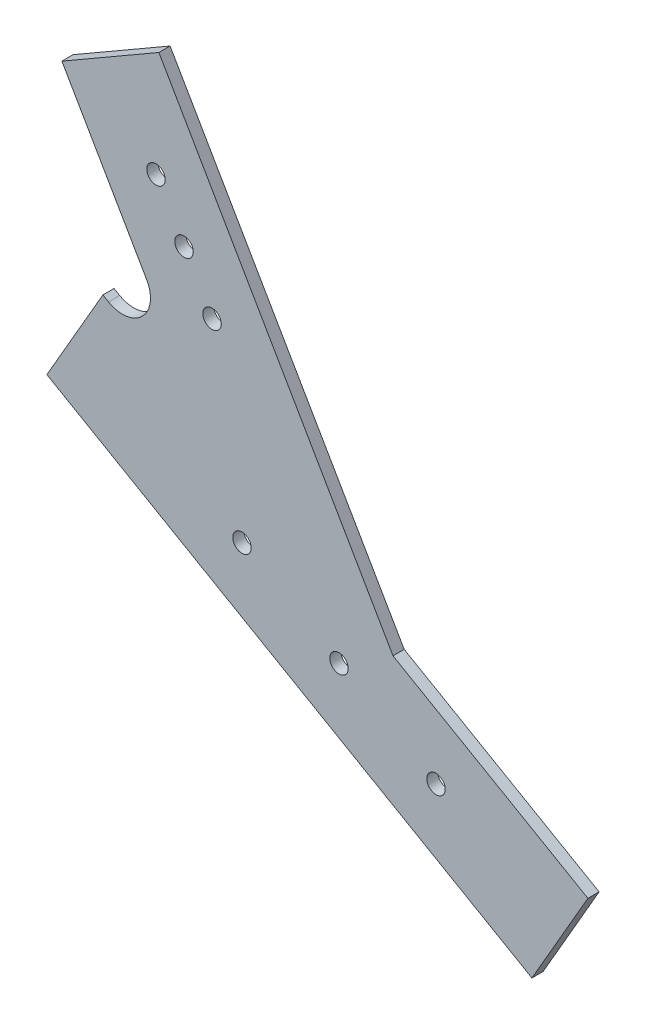
ISO-10303-21;
HEADER;
FILE_DESCRIPTION(('STEP AP214'),'2;1');
FILE_NAME('part.step','',(''),(''),'','','');
FILE_SCHEMA(('AUTOMOTIVE_DESIGN { 1 0 10303 214 1 1 1 1 }'));
ENDSEC;
DATA;
#1=APPLICATION_CONTEXT('core data for automotive mechanical design processes');
#2=APPLICATION_PROTOCOL_DEFINITION('international standard','automotive_design',2000,#1);
#3=PRODUCT_CONTEXT('',#1,'mechanical');
#4=PRODUCT('Part','Part','',(#3));
#5=PRODUCT_RELATED_PRODUCT_CATEGORY('part','',(#4));
#6=PRODUCT_DEFINITION_FORMATION('','',#4);
#7=PRODUCT_DEFINITION_CONTEXT('part definition',#1,'design');
#8=PRODUCT_DEFINITION('design','',#6,#7);
#9=PRODUCT_DEFINITION_SHAPE('','',#8);
#10=(LENGTH_UNIT() NAMED_UNIT(*) SI_UNIT(.MILLI.,.METRE.));
#11=(NAMED_UNIT(*) PLANE_ANGLE_UNIT() SI_UNIT($,.RADIAN.));
#12=(NAMED_UNIT(*) SI_UNIT($,.STERADIAN.) SOLID_ANGLE_UNIT());
#13=UNCERTAINTY_MEASURE_WITH_UNIT(LENGTH_MEASURE(1.E-05),#10,'distance_accuracy_value','');
#14=(GEOMETRIC_REPRESENTATION_CONTEXT(3) GLOBAL_UNCERTAINTY_ASSIGNED_CONTEXT((#13)) GLOBAL_UNIT_ASSIGNED_CONTEXT((#10,
#11,#12)) REPRESENTATION_CONTEXT('',''));
#15=CARTESIAN_POINT('',(0.,0.,0.));
#16=DIRECTION('',(0.,0.,1.));
#17=DIRECTION('',(1.,0.,0.));
#18=AXIS2_PLACEMENT_3D('',#15,#16,#17);
#19=CARTESIAN_POINT('',(-34.1093775697476,18.5019732230773,2.));
#20=DIRECTION('',(0.,0.,-1.));
#21=DIRECTION('',(-1.,0.,0.));
#22=AXIS2_PLACEMENT_3D('',#19,#20,#21);
#23=PLANE('',#22);
#24=DIRECTION('',(-0.866025403784438,0.500000000000001,0.));
#25=VECTOR('',#24,1.);
#26=CARTESIAN_POINT('',(-36.6093775697478,14.1718462041552,2.));
#27=LINE('',#26,#25);
#28=CARTESIAN_POINT('',(-36.6093775697478,14.1718462041552,2.));
#29=VERTEX_POINT('',#28);
#30=CARTESIAN_POINT('',(-37.6051894436111,14.7467784575924,2.));
#31=VERTEX_POINT('',#30);
#32=EDGE_CURVE('E161',#29,#31,#27,.T.);
#33=ORIENTED_EDGE('',*,*,#32,.T.);
#34=DIRECTION('',(-0.5,-0.866025403784439,0.));
#35=VECTOR('',#34,1.);
#36=CARTESIAN_POINT('',(-37.6051894436111,14.7467784575924,2.));
#37=LINE('',#36,#35);
#38=CARTESIAN_POINT('',(-47.6051894436111,-2.57372961809636,2.));
#39=VERTEX_POINT('',#38);
#40=EDGE_CURVE('E104',#31,#39,#37,.T.);
#41=ORIENTED_EDGE('',*,*,#40,.T.);
#42=DIRECTION('',(0.866025403784439,-0.5,0.));
#43=VECTOR('',#42,1.);
#44=CARTESIAN_POINT('',(-47.6051894436111,-2.57372961809636,2.));
#45=LINE('',#44,#43);
#46=CARTESIAN_POINT('',(38.9973509348328,-52.5737296180964,2.));
#47=VERTEX_POINT('',#46);
#48=EDGE_CURVE('E179',#39,#47,#45,.T.);
#49=ORIENTED_EDGE('',*,*,#48,.T.);
#50=DIRECTION('',(0.5,0.866025403784439,0.));
#51=VECTOR('',#50,1.);
#52=CARTESIAN_POINT('',(38.9973509348328,-52.5737296180964,2.));
#53=LINE('',#52,#51);
#54=CARTESIAN_POINT('',(48.9973509348327,-35.2532215424076,2.));
#55=VERTEX_POINT('',#54);
#56=EDGE_CURVE('E196',#47,#55,#53,.T.);
#57=ORIENTED_EDGE('',*,*,#56,.T.);
#58=DIRECTION('',(-0.866025403784438,0.500000000000001,0.));
#59=VECTOR('',#58,1.);
#60=CARTESIAN_POINT('',(14.1918926194672,-15.158280814763,2.));
#61=LINE('',#60,#59);
#62=CARTESIAN_POINT('',(14.1918926194672,-15.158280814763,2.));
#63=VERTEX_POINT('',#62);
#64=EDGE_CURVE('E195',#55,#63,#61,.T.);
#65=ORIENTED_EDGE('',*,*,#64,.T.);
#66=DIRECTION('',(-0.5,0.866025403784439,0.));
#67=VECTOR('',#66,1.);
#68=CARTESIAN_POINT('',(-27.605658613751,57.2372015531341,2.));
#69=LINE('',#68,#67);
#70=CARTESIAN_POINT('',(-27.605658613751,57.2372015531341,2.));
#71=VERTEX_POINT('',#70);
#72=EDGE_CURVE('E126',#63,#71,#69,.T.);
#73=ORIENTED_EDGE('',*,*,#72,.T.);
#74=DIRECTION('',(-0.866025403784439,-0.5,0.));
#75=VECTOR('',#74,1.);
#76=CARTESIAN_POINT('',(-44.9261666894362,47.2372015531362,2.));
#77=LINE('',#76,#75);
#78=CARTESIAN_POINT('',(-44.9261666894362,47.2372015531362,2.));
#79=VERTEX_POINT('',#78);
#80=EDGE_CURVE('E120',#71,#79,#77,.T.);
#81=ORIENTED_EDGE('',*,*,#80,.T.);
#82=DIRECTION('',(0.5,-0.866025403784439,0.));
#83=VECTOR('',#82,1.);
#84=CARTESIAN_POINT('',(-44.9261666894362,47.2372015531362,2.));
#85=LINE('',#84,#83);
#86=CARTESIAN_POINT('',(-29.7792505508256,21.0019732230775,2.));
#87=VERTEX_POINT('',#86);
#88=EDGE_CURVE('E124',#79,#87,#85,.T.);
#89=ORIENTED_EDGE('',*,*,#88,.T.);
#90=CARTESIAN_POINT('',(-34.1093775697476,18.5019732230773,2.));
#91=DIRECTION('',(0.,0.,-1.));
#92=DIRECTION('',(-1.,0.,0.));
#93=AXIS2_PLACEMENT_3D('',#90,#91,#92);
#94=CIRCLE('',#93,5.);
#95=EDGE_CURVE('E58',#87,#29,#94,.T.);
#96=ORIENTED_EDGE('',*,*,#95,.T.);
#97=EDGE_LOOP('',(#33,#41,#49,#57,#65,#73,#81,#89,#96));
#98=FACE_BOUND('',#97,.T.);
#99=CARTESIAN_POINT('',(21.8709445373254,-31.1387888904529,2.));
#100=DIRECTION('',(0.,0.,1.));
#101=DIRECTION('',(1.,0.,0.));
#102=AXIS2_PLACEMENT_3D('',#99,#100,#101);
#103=CIRCLE('',#102,1.65000000000005);
#104=CARTESIAN_POINT('',(23.5209445373254,-31.1387888904529,2.));
#105=VERTEX_POINT('',#104);
#106=EDGE_CURVE('E148',#105,#105,#103,.T.);
#107=ORIENTED_EDGE('',*,*,#106,.F.);
#108=EDGE_LOOP('',(#107));
#109=FACE_BOUND('',#108,.T.);
#110=CARTESIAN_POINT('',(4.5504364616365,-21.1387888904531,2.));
#111=DIRECTION('',(0.,0.,1.));
#112=DIRECTION('',(1.,0.,0.));
#113=AXIS2_PLACEMENT_3D('',#110,#111,#112);
#114=CIRCLE('',#113,1.65000000000007);
#115=CARTESIAN_POINT('',(6.20043646163657,-21.1387888904531,2.));
#116=VERTEX_POINT('',#115);
#117=EDGE_CURVE('E206',#116,#116,#114,.T.);
#118=ORIENTED_EDGE('',*,*,#117,.F.);
#119=EDGE_LOOP('',(#118));
#120=FACE_BOUND('',#119,.T.);
#121=CARTESIAN_POINT('',(-12.7700716140524,-11.1387888904533,2.));
#122=DIRECTION('',(0.,0.,1.));
#123=DIRECTION('',(1.,0.,0.));
#124=AXIS2_PLACEMENT_3D('',#121,#122,#123);
#125=CIRCLE('',#124,1.65000000000005);
#126=CARTESIAN_POINT('',(-11.1200716140524,-11.1387888904533,2.));
#127=VERTEX_POINT('',#126);
#128=EDGE_CURVE('E212',#127,#127,#125,.T.);
#129=ORIENTED_EDGE('',*,*,#128,.F.);
#130=EDGE_LOOP('',(#129));
#131=FACE_BOUND('',#130,.T.);
#132=CARTESIAN_POINT('',(-18.1176523058616,20.8034925653435,2.));
#133=DIRECTION('',(0.,0.,1.));
#134=DIRECTION('',(1.,0.,0.));
#135=AXIS2_PLACEMENT_3D('',#132,#133,#134);
#136=CIRCLE('',#135,1.65000000000002);
#137=CARTESIAN_POINT('',(-16.4676523058616,20.8034925653435,2.));
#138=VERTEX_POINT('',#137);
#139=EDGE_CURVE('E218',#138,#138,#136,.T.);
#140=ORIENTED_EDGE('',*,*,#139,.F.);
#141=EDGE_LOOP('',(#140));
#142=FACE_BOUND('',#141,.T.);
#143=CARTESIAN_POINT('',(-23.1176523058618,29.4637466031877,2.));
#144=DIRECTION('',(0.,0.,1.));
#145=DIRECTION('',(1.,0.,0.));
#146=AXIS2_PLACEMENT_3D('',#143,#144,#145);
#147=CIRCLE('',#146,1.64999999999999);
#148=CARTESIAN_POINT('',(-21.4676523058618,29.4637466031877,2.));
#149=VERTEX_POINT('',#148);
#150=EDGE_CURVE('E224',#149,#149,#147,.T.);
#151=ORIENTED_EDGE('',*,*,#150,.F.);
#152=EDGE_LOOP('',(#151));
#153=FACE_BOUND('',#152,.T.);
#154=CARTESIAN_POINT('',(-28.117652305862,38.1240006410319,2.));
#155=DIRECTION('',(0.,0.,1.));
#156=DIRECTION('',(1.,0.,0.));
#157=AXIS2_PLACEMENT_3D('',#154,#155,#156);
#158=CIRCLE('',#157,1.64999999999999);
#159=CARTESIAN_POINT('',(-26.467652305862,38.1240006410319,2.));
#160=VERTEX_POINT('',#159);
#161=EDGE_CURVE('E230',#160,#160,#158,.T.);
#162=ORIENTED_EDGE('',*,*,#161,.F.);
#163=EDGE_LOOP('',(#162));
#164=FACE_BOUND('',#163,.T.);
#165=ADVANCED_FACE('F41',(#98,#109,#120,#131,#142,#153,#164),#23,.F.);
#166=CARTESIAN_POINT('',(-34.1093775697476,18.5019732230773,0.));
#167=DIRECTION('',(0.,0.,-1.));
#168=DIRECTION('',(-1.,0.,0.));
#169=AXIS2_PLACEMENT_3D('',#166,#167,#168);
#170=PLANE('',#169);
#171=CARTESIAN_POINT('',(-23.1176523058618,29.4637466031877,0.));
#172=DIRECTION('',(0.,0.,1.));
#173=DIRECTION('',(1.,0.,0.));
#174=AXIS2_PLACEMENT_3D('',#171,#172,#173);
#175=CIRCLE('',#174,1.64999999999999);
#176=CARTESIAN_POINT('',(-21.4676523058618,29.4637466031877,0.));
#177=VERTEX_POINT('',#176);
#178=EDGE_CURVE('E227',#177,#177,#175,.T.);
#179=ORIENTED_EDGE('',*,*,#178,.T.);
#180=EDGE_LOOP('',(#179));
#181=FACE_BOUND('',#180,.T.);
#182=CARTESIAN_POINT('',(-12.7700716140524,-11.1387888904533,0.));
#183=DIRECTION('',(0.,0.,1.));
#184=DIRECTION('',(1.,0.,0.));
#185=AXIS2_PLACEMENT_3D('',#182,#183,#184);
#186=CIRCLE('',#185,1.65000000000005);
#187=CARTESIAN_POINT('',(-11.1200716140524,-11.1387888904533,0.));
#188=VERTEX_POINT('',#187);
#189=EDGE_CURVE('E215',#188,#188,#186,.T.);
#190=ORIENTED_EDGE('',*,*,#189,.T.);
#191=EDGE_LOOP('',(#190));
#192=FACE_BOUND('',#191,.T.);
#193=CARTESIAN_POINT('',(21.8709445373254,-31.1387888904529,0.));
#194=DIRECTION('',(0.,0.,1.));
#195=DIRECTION('',(1.,0.,0.));
#196=AXIS2_PLACEMENT_3D('',#193,#194,#195);
#197=CIRCLE('',#196,1.65000000000005);
#198=CARTESIAN_POINT('',(23.5209445373254,-31.1387888904529,0.));
#199=VERTEX_POINT('',#198);
#200=EDGE_CURVE('E203',#199,#199,#197,.T.);
#201=ORIENTED_EDGE('',*,*,#200,.T.);
#202=EDGE_LOOP('',(#201));
#203=FACE_BOUND('',#202,.T.);
#204=DIRECTION('',(-0.866025403784438,0.500000000000001,0.));
#205=VECTOR('',#204,1.);
#206=CARTESIAN_POINT('',(-36.6093775697478,14.1718462041552,0.));
#207=LINE('',#206,#205);
#208=CARTESIAN_POINT('',(-36.6093775697478,14.1718462041552,0.));
#209=VERTEX_POINT('',#208);
#210=CARTESIAN_POINT('',(-37.6051894436111,14.7467784575924,0.));
#211=VERTEX_POINT('',#210);
#212=EDGE_CURVE('E144',#209,#211,#207,.T.);
#213=ORIENTED_EDGE('',*,*,#212,.F.);
#214=CARTESIAN_POINT('',(-34.1093775697476,18.5019732230773,0.));
#215=DIRECTION('',(0.,0.,-1.));
#216=DIRECTION('',(-1.,0.,0.));
#217=AXIS2_PLACEMENT_3D('',#214,#215,#216);
#218=CIRCLE('',#217,5.);
#219=CARTESIAN_POINT('',(-29.7792505508256,21.0019732230775,0.));
#220=VERTEX_POINT('',#219);
#221=EDGE_CURVE('E96',#220,#209,#218,.T.);
#222=ORIENTED_EDGE('',*,*,#221,.F.);
#223=DIRECTION('',(0.5,-0.866025403784439,0.));
#224=VECTOR('',#223,1.);
#225=CARTESIAN_POINT('',(-44.9261666894362,47.2372015531362,0.));
#226=LINE('',#225,#224);
#227=CARTESIAN_POINT('',(-44.9261666894362,47.2372015531362,0.));
#228=VERTEX_POINT('',#227);
#229=EDGE_CURVE('E90',#228,#220,#226,.T.);
#230=ORIENTED_EDGE('',*,*,#229,.F.);
#231=DIRECTION('',(-0.866025403784439,-0.5,0.));
#232=VECTOR('',#231,1.);
#233=CARTESIAN_POINT('',(-44.9261666894362,47.2372015531362,0.));
#234=LINE('',#233,#232);
#235=CARTESIAN_POINT('',(-27.605658613751,57.2372015531341,0.));
#236=VERTEX_POINT('',#235);
#237=EDGE_CURVE('E134',#236,#228,#234,.T.);
#238=ORIENTED_EDGE('',*,*,#237,.F.);
#239=DIRECTION('',(-0.5,0.866025403784439,0.));
#240=VECTOR('',#239,1.);
#241=CARTESIAN_POINT('',(-27.605658613751,57.2372015531341,0.));
#242=LINE('',#241,#240);
#243=CARTESIAN_POINT('',(14.1918926194672,-15.158280814763,0.));
#244=VERTEX_POINT('',#243);
#245=EDGE_CURVE('E156',#244,#236,#242,.T.);
#246=ORIENTED_EDGE('',*,*,#245,.F.);
#247=DIRECTION('',(-0.866025403784438,0.500000000000001,0.));
#248=VECTOR('',#247,1.);
#249=CARTESIAN_POINT('',(14.1918926194672,-15.158280814763,0.));
#250=LINE('',#249,#248);
#251=CARTESIAN_POINT('',(48.9973509348327,-35.2532215424076,0.));
#252=VERTEX_POINT('',#251);
#253=EDGE_CURVE('E154',#252,#244,#250,.T.);
#254=ORIENTED_EDGE('',*,*,#253,.F.);
#255=DIRECTION('',(0.5,0.866025403784439,0.));
#256=VECTOR('',#255,1.);
#257=CARTESIAN_POINT('',(38.9973509348328,-52.5737296180964,0.));
#258=LINE('',#257,#256);
#259=CARTESIAN_POINT('',(38.9973509348328,-52.5737296180964,0.));
#260=VERTEX_POINT('',#259);
#261=EDGE_CURVE('E152',#260,#252,#258,.T.);
#262=ORIENTED_EDGE('',*,*,#261,.F.);
#263=DIRECTION('',(0.866025403784439,-0.5,0.));
#264=VECTOR('',#263,1.);
#265=CARTESIAN_POINT('',(-47.6051894436111,-2.57372961809636,0.));
#266=LINE('',#265,#264);
#267=CARTESIAN_POINT('',(-47.6051894436111,-2.57372961809636,0.));
#268=VERTEX_POINT('',#267);
#269=EDGE_CURVE('E150',#268,#260,#266,.T.);
#270=ORIENTED_EDGE('',*,*,#269,.F.);
#271=DIRECTION('',(-0.5,-0.866025403784439,0.));
#272=VECTOR('',#271,1.);
#273=CARTESIAN_POINT('',(-37.6051894436111,14.7467784575924,0.));
#274=LINE('',#273,#272);
#275=EDGE_CURVE('E147',#211,#268,#274,.T.);
#276=ORIENTED_EDGE('',*,*,#275,.F.);
#277=EDGE_LOOP('',(#213,#222,#230,#238,#246,#254,#262,#270,#276));
#278=FACE_BOUND('',#277,.T.);
#279=CARTESIAN_POINT('',(4.5504364616365,-21.1387888904531,0.));
#280=DIRECTION('',(0.,0.,1.));
#281=DIRECTION('',(1.,0.,0.));
#282=AXIS2_PLACEMENT_3D('',#279,#280,#281);
#283=CIRCLE('',#282,1.65000000000007);
#284=CARTESIAN_POINT('',(6.20043646163657,-21.1387888904531,0.));
#285=VERTEX_POINT('',#284);
#286=EDGE_CURVE('E209',#285,#285,#283,.T.);
#287=ORIENTED_EDGE('',*,*,#286,.T.);
#288=EDGE_LOOP('',(#287));
#289=FACE_BOUND('',#288,.T.);
#290=CARTESIAN_POINT('',(-18.1176523058616,20.8034925653435,0.));
#291=DIRECTION('',(0.,0.,1.));
#292=DIRECTION('',(1.,0.,0.));
#293=AXIS2_PLACEMENT_3D('',#290,#291,#292);
#294=CIRCLE('',#293,1.65000000000002);
#295=CARTESIAN_POINT('',(-16.4676523058616,20.8034925653435,0.));
#296=VERTEX_POINT('',#295);
#297=EDGE_CURVE('E221',#296,#296,#294,.T.);
#298=ORIENTED_EDGE('',*,*,#297,.T.);
#299=EDGE_LOOP('',(#298));
#300=FACE_BOUND('',#299,.T.);
#301=CARTESIAN_POINT('',(-28.117652305862,38.1240006410319,0.));
#302=DIRECTION('',(0.,0.,1.));
#303=DIRECTION('',(1.,0.,0.));
#304=AXIS2_PLACEMENT_3D('',#301,#302,#303);
#305=CIRCLE('',#304,1.64999999999999);
#306=CARTESIAN_POINT('',(-26.467652305862,38.1240006410319,0.));
#307=VERTEX_POINT('',#306);
#308=EDGE_CURVE('E233',#307,#307,#305,.T.);
#309=ORIENTED_EDGE('',*,*,#308,.T.);
#310=EDGE_LOOP('',(#309));
#311=FACE_BOUND('',#310,.T.);
#312=ADVANCED_FACE('F183',(#181,#192,#203,#278,#289,#300,#311),#170,.T.);
#313=CARTESIAN_POINT('',(-36.6093775697478,14.1718462041552,2.));
#314=DIRECTION('',(-0.500000000000001,-0.866025403784438,0.));
#315=DIRECTION('',(0.866025403784438,-0.500000000000001,0.));
#316=AXIS2_PLACEMENT_3D('',#313,#314,#315);
#317=PLANE('',#316);
#318=ORIENTED_EDGE('',*,*,#212,.T.);
#319=DIRECTION('',(0.,0.,-1.));
#320=VECTOR('',#319,1.);
#321=CARTESIAN_POINT('',(-37.6051894436111,14.7467784575924,2.));
#322=LINE('',#321,#320);
#323=EDGE_CURVE('E11',#31,#211,#322,.T.);
#324=ORIENTED_EDGE('',*,*,#323,.F.);
#325=ORIENTED_EDGE('',*,*,#32,.F.);
#326=DIRECTION('',(0.,0.,-1.));
#327=VECTOR('',#326,1.);
#328=CARTESIAN_POINT('',(-36.6093775697478,14.1718462041552,2.));
#329=LINE('',#328,#327);
#330=EDGE_CURVE('E140',#29,#209,#329,.T.);
#331=ORIENTED_EDGE('',*,*,#330,.T.);
#332=EDGE_LOOP('',(#318,#324,#325,#331));
#333=FACE_BOUND('',#332,.T.);
#334=ADVANCED_FACE('F43',(#333),#317,.F.);
#335=CARTESIAN_POINT('',(-37.6051894436111,14.7467784575924,2.));
#336=DIRECTION('',(0.866025403784439,-0.5,0.));
#337=DIRECTION('',(0.5,0.866025403784439,0.));
#338=AXIS2_PLACEMENT_3D('',#335,#336,#337);
#339=PLANE('',#338);
#340=ORIENTED_EDGE('',*,*,#275,.T.);
#341=DIRECTION('',(0.,0.,-1.));
#342=VECTOR('',#341,1.);
#343=CARTESIAN_POINT('',(-47.6051894436111,-2.57372961809636,2.));
#344=LINE('',#343,#342);
#345=EDGE_CURVE('E50',#39,#268,#344,.T.);
#346=ORIENTED_EDGE('',*,*,#345,.F.);
#347=ORIENTED_EDGE('',*,*,#40,.F.);
#348=ORIENTED_EDGE('',*,*,#323,.T.);
#349=EDGE_LOOP('',(#340,#346,#347,#348));
#350=FACE_BOUND('',#349,.T.);
#351=ADVANCED_FACE('F269',(#350),#339,.F.);
#352=CARTESIAN_POINT('',(-47.6051894436111,-2.57372961809636,2.));
#353=DIRECTION('',(0.5,0.866025403784439,0.));
#354=DIRECTION('',(-0.866025403784439,0.5,0.));
#355=AXIS2_PLACEMENT_3D('',#352,#353,#354);
#356=PLANE('',#355);
#357=ORIENTED_EDGE('',*,*,#269,.T.);
#358=DIRECTION('',(0.,0.,-1.));
#359=VECTOR('',#358,1.);
#360=CARTESIAN_POINT('',(38.9973509348328,-52.5737296180964,2.));
#361=LINE('',#360,#359);
#362=EDGE_CURVE('E171',#47,#260,#361,.T.);
#363=ORIENTED_EDGE('',*,*,#362,.F.);
#364=ORIENTED_EDGE('',*,*,#48,.F.);
#365=ORIENTED_EDGE('',*,*,#345,.T.);
#366=EDGE_LOOP('',(#357,#363,#364,#365));
#367=FACE_BOUND('',#366,.T.);
#368=ADVANCED_FACE('F177',(#367),#356,.F.);
#369=CARTESIAN_POINT('',(38.9973509348328,-52.5737296180964,2.));
#370=DIRECTION('',(-0.866025403784439,0.5,0.));
#371=DIRECTION('',(-0.5,-0.866025403784439,0.));
#372=AXIS2_PLACEMENT_3D('',#369,#370,#371);
#373=PLANE('',#372);
#374=ORIENTED_EDGE('',*,*,#261,.T.);
#375=DIRECTION('',(0.,0.,-1.));
#376=VECTOR('',#375,1.);
#377=CARTESIAN_POINT('',(48.9973509348327,-35.2532215424076,2.));
#378=LINE('',#377,#376);
#379=EDGE_CURVE('E168',#55,#252,#378,.T.);
#380=ORIENTED_EDGE('',*,*,#379,.F.);
#381=ORIENTED_EDGE('',*,*,#56,.F.);
#382=ORIENTED_EDGE('',*,*,#362,.T.);
#383=EDGE_LOOP('',(#374,#380,#381,#382));
#384=FACE_BOUND('',#383,.T.);
#385=ADVANCED_FACE('F189',(#384),#373,.F.);
#386=CARTESIAN_POINT('',(14.1918926194672,-15.158280814763,2.));
#387=DIRECTION('',(-0.500000000000001,-0.866025403784438,0.));
#388=DIRECTION('',(0.866025403784438,-0.500000000000001,0.));
#389=AXIS2_PLACEMENT_3D('',#386,#387,#388);
#390=PLANE('',#389);
#391=ORIENTED_EDGE('',*,*,#253,.T.);
#392=DIRECTION('',(0.,0.,-1.));
#393=VECTOR('',#392,1.);
#394=CARTESIAN_POINT('',(14.1918926194672,-15.158280814763,2.));
#395=LINE('',#394,#393);
#396=EDGE_CURVE('E165',#63,#244,#395,.T.);
#397=ORIENTED_EDGE('',*,*,#396,.F.);
#398=ORIENTED_EDGE('',*,*,#64,.F.);
#399=ORIENTED_EDGE('',*,*,#379,.T.);
#400=EDGE_LOOP('',(#391,#397,#398,#399));
#401=FACE_BOUND('',#400,.T.);
#402=ADVANCED_FACE('F193',(#401),#390,.F.);
#403=CARTESIAN_POINT('',(-27.605658613751,57.2372015531341,2.));
#404=DIRECTION('',(-0.866025403784439,-0.5,0.));
#405=DIRECTION('',(0.5,-0.866025403784439,0.));
#406=AXIS2_PLACEMENT_3D('',#403,#404,#405);
#407=PLANE('',#406);
#408=ORIENTED_EDGE('',*,*,#245,.T.);
#409=DIRECTION('',(0.,0.,-1.));
#410=VECTOR('',#409,1.);
#411=CARTESIAN_POINT('',(-27.605658613751,57.2372015531341,2.));
#412=LINE('',#411,#410);
#413=EDGE_CURVE('E135',#71,#236,#412,.T.);
#414=ORIENTED_EDGE('',*,*,#413,.F.);
#415=ORIENTED_EDGE('',*,*,#72,.F.);
#416=ORIENTED_EDGE('',*,*,#396,.T.);
#417=EDGE_LOOP('',(#408,#414,#415,#416));
#418=FACE_BOUND('',#417,.T.);
#419=ADVANCED_FACE('F260',(#418),#407,.F.);
#420=CARTESIAN_POINT('',(-44.9261666894362,47.2372015531362,2.));
#421=DIRECTION('',(0.5,-0.866025403784439,0.));
#422=DIRECTION('',(0.866025403784439,0.5,0.));
#423=AXIS2_PLACEMENT_3D('',#420,#421,#422);
#424=PLANE('',#423);
#425=ORIENTED_EDGE('',*,*,#237,.T.);
#426=DIRECTION('',(0.,0.,-1.));
#427=VECTOR('',#426,1.);
#428=CARTESIAN_POINT('',(-44.9261666894362,47.2372015531362,2.));
#429=LINE('',#428,#427);
#430=EDGE_CURVE('E131',#79,#228,#429,.T.);
#431=ORIENTED_EDGE('',*,*,#430,.F.);
#432=ORIENTED_EDGE('',*,*,#80,.F.);
#433=ORIENTED_EDGE('',*,*,#413,.T.);
#434=EDGE_LOOP('',(#425,#431,#432,#433));
#435=FACE_BOUND('',#434,.T.);
#436=ADVANCED_FACE('F132',(#435),#424,.F.);
#437=CARTESIAN_POINT('',(-44.9261666894362,47.2372015531362,2.));
#438=DIRECTION('',(0.866025403784439,0.5,0.));
#439=DIRECTION('',(-0.5,0.866025403784439,0.));
#440=AXIS2_PLACEMENT_3D('',#437,#438,#439);
#441=PLANE('',#440);
#442=ORIENTED_EDGE('',*,*,#229,.T.);
#443=DIRECTION('',(0.,0.,-1.));
#444=VECTOR('',#443,1.);
#445=CARTESIAN_POINT('',(-29.7792505508256,21.0019732230775,2.));
#446=LINE('',#445,#444);
#447=EDGE_CURVE('E136',#87,#220,#446,.T.);
#448=ORIENTED_EDGE('',*,*,#447,.F.);
#449=ORIENTED_EDGE('',*,*,#88,.F.);
#450=ORIENTED_EDGE('',*,*,#430,.T.);
#451=EDGE_LOOP('',(#442,#448,#449,#450));
#452=FACE_BOUND('',#451,.T.);
#453=ADVANCED_FACE('F138',(#452),#441,.F.);
#454=CARTESIAN_POINT('',(-34.1093775697476,18.5019732230773,2.));
#455=DIRECTION('',(0.,0.,-1.));
#456=DIRECTION('',(-1.,0.,0.));
#457=AXIS2_PLACEMENT_3D('',#454,#455,#456);
#458=CYLINDRICAL_SURFACE('',#457,5.);
#459=ORIENTED_EDGE('',*,*,#221,.T.);
#460=ORIENTED_EDGE('',*,*,#330,.F.);
#461=ORIENTED_EDGE('',*,*,#95,.F.);
#462=ORIENTED_EDGE('',*,*,#447,.T.);
#463=EDGE_LOOP('',(#459,#460,#461,#462));
#464=FACE_BOUND('',#463,.T.);
#465=ADVANCED_FACE('F253',(#464),#458,.F.);
#466=CARTESIAN_POINT('',(21.8709445373254,-31.1387888904529,2.));
#467=DIRECTION('',(0.,0.,-1.));
#468=DIRECTION('',(-1.,0.,0.));
#469=AXIS2_PLACEMENT_3D('',#466,#467,#468);
#470=CYLINDRICAL_SURFACE('',#469,1.65000000000005);
#471=ORIENTED_EDGE('',*,*,#106,.T.);
#472=EDGE_LOOP('',(#471));
#473=FACE_BOUND('',#472,.T.);
#474=ORIENTED_EDGE('',*,*,#200,.F.);
#475=EDGE_LOOP('',(#474));
#476=FACE_BOUND('',#475,.T.);
#477=ADVANCED_FACE('F250',(#473,#476),#470,.F.);
#478=CARTESIAN_POINT('',(4.5504364616365,-21.1387888904531,2.));
#479=DIRECTION('',(0.,0.,-1.));
#480=DIRECTION('',(-1.,0.,0.));
#481=AXIS2_PLACEMENT_3D('',#478,#479,#480);
#482=CYLINDRICAL_SURFACE('',#481,1.65000000000007);
#483=ORIENTED_EDGE('',*,*,#117,.T.);
#484=EDGE_LOOP('',(#483));
#485=FACE_BOUND('',#484,.T.);
#486=ORIENTED_EDGE('',*,*,#286,.F.);
#487=EDGE_LOOP('',(#486));
#488=FACE_BOUND('',#487,.T.);
#489=ADVANCED_FACE('F337',(#485,#488),#482,.F.);
#490=CARTESIAN_POINT('',(-12.7700716140524,-11.1387888904533,2.));
#491=DIRECTION('',(0.,0.,-1.));
#492=DIRECTION('',(-1.,0.,0.));
#493=AXIS2_PLACEMENT_3D('',#490,#491,#492);
#494=CYLINDRICAL_SURFACE('',#493,1.65000000000005);
#495=ORIENTED_EDGE('',*,*,#128,.T.);
#496=EDGE_LOOP('',(#495));
#497=FACE_BOUND('',#496,.T.);
#498=ORIENTED_EDGE('',*,*,#189,.F.);
#499=EDGE_LOOP('',(#498));
#500=FACE_BOUND('',#499,.T.);
#501=ADVANCED_FACE('F345',(#497,#500),#494,.F.);
#502=CARTESIAN_POINT('',(-18.1176523058616,20.8034925653435,2.));
#503=DIRECTION('',(0.,0.,-1.));
#504=DIRECTION('',(-1.,0.,0.));
#505=AXIS2_PLACEMENT_3D('',#502,#503,#504);
#506=CYLINDRICAL_SURFACE('',#505,1.65000000000002);
#507=ORIENTED_EDGE('',*,*,#139,.T.);
#508=EDGE_LOOP('',(#507));
#509=FACE_BOUND('',#508,.T.);
#510=ORIENTED_EDGE('',*,*,#297,.F.);
#511=EDGE_LOOP('',(#510));
#512=FACE_BOUND('',#511,.T.);
#513=ADVANCED_FACE('F353',(#509,#512),#506,.F.);
#514=CARTESIAN_POINT('',(-23.1176523058618,29.4637466031877,2.));
#515=DIRECTION('',(0.,0.,-1.));
#516=DIRECTION('',(-1.,0.,0.));
#517=AXIS2_PLACEMENT_3D('',#514,#515,#516);
#518=CYLINDRICAL_SURFACE('',#517,1.64999999999999);
#519=ORIENTED_EDGE('',*,*,#150,.T.);
#520=EDGE_LOOP('',(#519));
#521=FACE_BOUND('',#520,.T.);
#522=ORIENTED_EDGE('',*,*,#178,.F.);
#523=EDGE_LOOP('',(#522));
#524=FACE_BOUND('',#523,.T.);
#525=ADVANCED_FACE('F362',(#521,#524),#518,.F.);
#526=CARTESIAN_POINT('',(-28.117652305862,38.1240006410319,2.));
#527=DIRECTION('',(0.,0.,-1.));
#528=DIRECTION('',(-1.,0.,0.));
#529=AXIS2_PLACEMENT_3D('',#526,#527,#528);
#530=CYLINDRICAL_SURFACE('',#529,1.64999999999999);
#531=ORIENTED_EDGE('',*,*,#161,.T.);
#532=EDGE_LOOP('',(#531));
#533=FACE_BOUND('',#532,.T.);
#534=ORIENTED_EDGE('',*,*,#308,.F.);
#535=EDGE_LOOP('',(#534));
#536=FACE_BOUND('',#535,.T.);
#537=ADVANCED_FACE('F239',(#533,#536),#530,.F.);
#538=CLOSED_SHELL('',(#165,#312,#334,#351,#368,#385,#402,#419,#436,#453,#465,#477,#489,#501,
#513,#525,#537));
#539=MANIFOLD_SOLID_BREP('B2',#538);
#540=ADVANCED_BREP_SHAPE_REPRESENTATION('',(#18,#539),#14);
#541=SHAPE_DEFINITION_REPRESENTATION(#9,#540);
ENDSEC;
END-ISO-10303-21;
